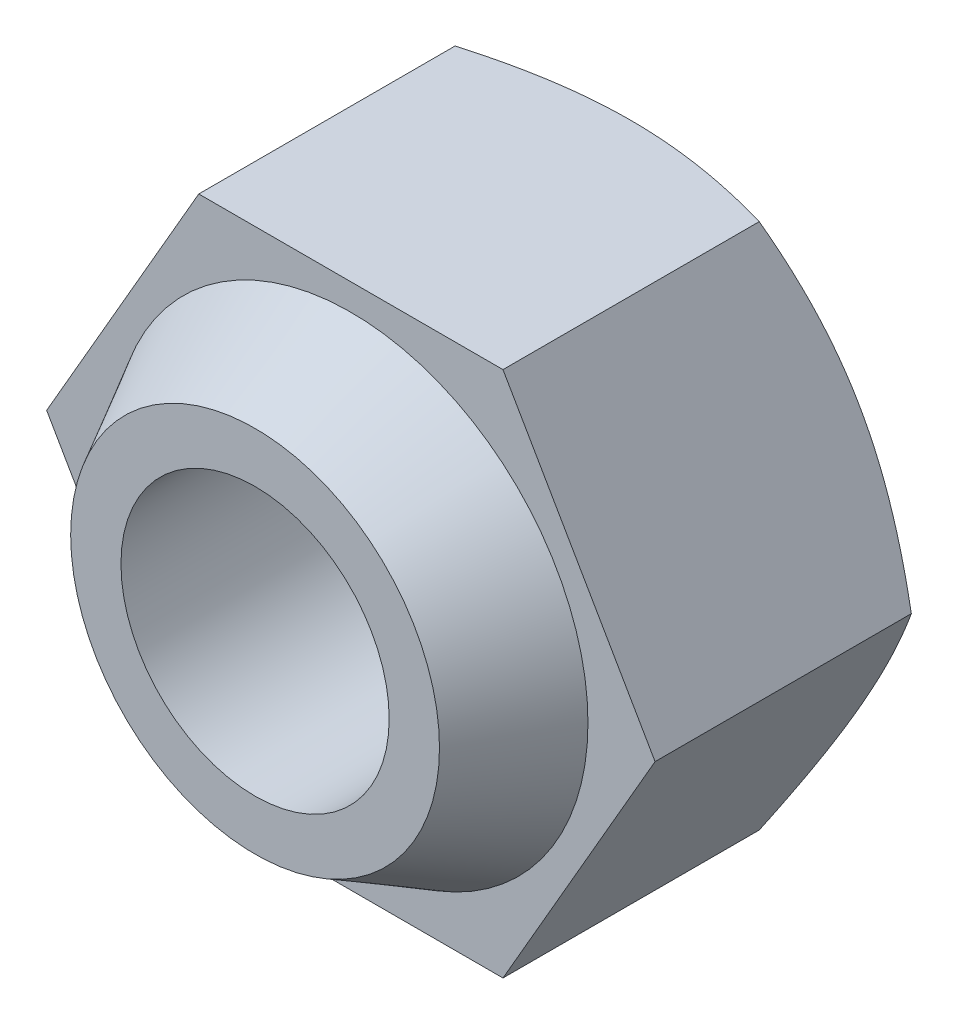
ISO-10303-21;
HEADER;
FILE_DESCRIPTION(('STEP AP214'),'2;1');
FILE_NAME('part.step','',(''),(''),'','','');
FILE_SCHEMA(('AUTOMOTIVE_DESIGN { 1 0 10303 214 1 1 1 1 }'));
ENDSEC;
DATA;
#1=APPLICATION_CONTEXT('core data for automotive mechanical design processes');
#2=APPLICATION_PROTOCOL_DEFINITION('international standard','automotive_design',2000,#1);
#3=PRODUCT_CONTEXT('',#1,'mechanical');
#4=PRODUCT('Part','Part','',(#3));
#5=PRODUCT_RELATED_PRODUCT_CATEGORY('part','',(#4));
#6=PRODUCT_DEFINITION_FORMATION('','',#4);
#7=PRODUCT_DEFINITION_CONTEXT('part definition',#1,'design');
#8=PRODUCT_DEFINITION('design','',#6,#7);
#9=PRODUCT_DEFINITION_SHAPE('','',#8);
#10=(LENGTH_UNIT() NAMED_UNIT(*) SI_UNIT(.MILLI.,.METRE.));
#11=(NAMED_UNIT(*) PLANE_ANGLE_UNIT() SI_UNIT($,.RADIAN.));
#12=(NAMED_UNIT(*) SI_UNIT($,.STERADIAN.) SOLID_ANGLE_UNIT());
#13=UNCERTAINTY_MEASURE_WITH_UNIT(LENGTH_MEASURE(1.E-05),#10,'distance_accuracy_value','');
#14=(GEOMETRIC_REPRESENTATION_CONTEXT(3) GLOBAL_UNCERTAINTY_ASSIGNED_CONTEXT((#13)) GLOBAL_UNIT_ASSIGNED_CONTEXT((#10,
#11,#12)) REPRESENTATION_CONTEXT('',''));
#15=CARTESIAN_POINT('',(0.,0.,0.));
#16=DIRECTION('',(0.,0.,1.));
#17=DIRECTION('',(1.,0.,0.));
#18=AXIS2_PLACEMENT_3D('',#15,#16,#17);
#19=CARTESIAN_POINT('',(0.,0.,4.));
#20=DIRECTION('',(0.,0.,1.));
#21=DIRECTION('',(1.,0.,0.));
#22=AXIS2_PLACEMENT_3D('',#19,#20,#21);
#23=PLANE('',#22);
#24=CARTESIAN_POINT('',(0.,0.,4.));
#25=DIRECTION('',(0.,0.,1.));
#26=DIRECTION('',(1.,0.,0.));
#27=AXIS2_PLACEMENT_3D('',#24,#25,#26);
#28=CIRCLE('',#27,1.4);
#29=CARTESIAN_POINT('',(1.4,0.,4.));
#30=VERTEX_POINT('',#29);
#31=EDGE_CURVE('E9',#30,#30,#28,.T.);
#32=ORIENTED_EDGE('',*,*,#31,.F.);
#33=EDGE_LOOP('',(#32));
#34=FACE_BOUND('',#33,.T.);
#35=CARTESIAN_POINT('',(0.,0.,4.));
#36=DIRECTION('',(0.,0.,1.));
#37=DIRECTION('',(1.,0.,0.));
#38=AXIS2_PLACEMENT_3D('',#35,#36,#37);
#39=CIRCLE('',#38,1.925);
#40=CARTESIAN_POINT('',(1.925,0.,4.));
#41=VERTEX_POINT('',#40);
#42=EDGE_CURVE('E136',#41,#41,#39,.T.);
#43=ORIENTED_EDGE('',*,*,#42,.T.);
#44=EDGE_LOOP('',(#43));
#45=FACE_BOUND('',#44,.T.);
#46=ADVANCED_FACE('F14',(#34,#45),#23,.T.);
#47=CARTESIAN_POINT('',(0.,0.,-5.));
#48=DIRECTION('',(0.,0.,1.));
#49=DIRECTION('',(1.,0.,0.));
#50=AXIS2_PLACEMENT_3D('',#47,#48,#49);
#51=CYLINDRICAL_SURFACE('',#50,1.4);
#52=DIRECTION('',(0.,0.,1.));
#53=VECTOR('',#52,1.);
#54=CARTESIAN_POINT('',(1.4,0.,-5.));
#55=LINE('',#54,#53);
#56=CARTESIAN_POINT('',(1.4,0.,0.));
#57=VERTEX_POINT('',#56);
#58=EDGE_CURVE('E25',#57,#30,#55,.T.);
#59=ORIENTED_EDGE('',*,*,#58,.F.);
#60=CARTESIAN_POINT('',(0.,0.,0.));
#61=DIRECTION('',(0.,0.,1.));
#62=DIRECTION('',(1.,0.,0.));
#63=AXIS2_PLACEMENT_3D('',#60,#61,#62);
#64=CIRCLE('',#63,1.4);
#65=EDGE_CURVE('E144',#57,#57,#64,.T.);
#66=ORIENTED_EDGE('',*,*,#65,.F.);
#67=ORIENTED_EDGE('',*,*,#58,.T.);
#68=ORIENTED_EDGE('',*,*,#31,.T.);
#69=EDGE_LOOP('',(#59,#66,#67,#68));
#70=FACE_BOUND('',#69,.T.);
#71=ADVANCED_FACE('F223',(#70),#51,.F.);
#72=CARTESIAN_POINT('',(0.,0.,3.));
#73=DIRECTION('',(0.,0.,-1.));
#74=DIRECTION('',(1.,0.,0.));
#75=AXIS2_PLACEMENT_3D('',#72,#73,#74);
#76=CONICAL_SURFACE('',#75,2.475,0.502843210928);
#77=ORIENTED_EDGE('',*,*,#42,.F.);
#78=DIRECTION('',(-0.481918749771887,0.,0.876215908676795));
#79=VECTOR('',#78,1.);
#80=CARTESIAN_POINT('',(2.475,0.,3.));
#81=LINE('',#80,#79);
#82=CARTESIAN_POINT('',(2.475,0.,3.));
#83=VERTEX_POINT('',#82);
#84=EDGE_CURVE('E143',#83,#41,#81,.T.);
#85=ORIENTED_EDGE('',*,*,#84,.F.);
#86=CARTESIAN_POINT('',(0.,0.,3.));
#87=DIRECTION('',(0.,0.,1.));
#88=DIRECTION('',(1.,0.,0.));
#89=AXIS2_PLACEMENT_3D('',#86,#87,#88);
#90=CIRCLE('',#89,2.475);
#91=EDGE_CURVE('E18',#83,#83,#90,.T.);
#92=ORIENTED_EDGE('',*,*,#91,.T.);
#93=ORIENTED_EDGE('',*,*,#84,.T.);
#94=EDGE_LOOP('',(#77,#85,#92,#93));
#95=FACE_BOUND('',#94,.T.);
#96=ADVANCED_FACE('F228',(#95),#76,.T.);
#97=CARTESIAN_POINT('',(0.,0.,0.));
#98=DIRECTION('',(0.,0.,1.));
#99=DIRECTION('',(1.,0.,0.));
#100=AXIS2_PLACEMENT_3D('',#97,#98,#99);
#101=PLANE('',#100);
#102=ORIENTED_EDGE('',*,*,#65,.T.);
#103=EDGE_LOOP('',(#102));
#104=FACE_BOUND('',#103,.T.);
#105=CARTESIAN_POINT('',(0.,0.,0.));
#106=DIRECTION('',(0.,0.,1.));
#107=DIRECTION('',(1.,0.,0.));
#108=AXIS2_PLACEMENT_3D('',#105,#106,#107);
#109=CIRCLE('',#108,2.6125);
#110=CARTESIAN_POINT('',(2.6125,0.,0.));
#111=VERTEX_POINT('',#110);
#112=EDGE_CURVE('E169',#111,#111,#109,.T.);
#113=ORIENTED_EDGE('',*,*,#112,.F.);
#114=EDGE_LOOP('',(#113));
#115=FACE_BOUND('',#114,.T.);
#116=ADVANCED_FACE('F16',(#104,#115),#101,.F.);
#117=CARTESIAN_POINT('',(-1.587713240271,-2.75,0.));
#118=DIRECTION('',(0.,1.,0.));
#119=DIRECTION('',(1.,0.,0.));
#120=AXIS2_PLACEMENT_3D('',#117,#118,#119);
#121=PLANE('',#120);
#122=DIRECTION('',(0.,0.,1.));
#123=VECTOR('',#122,1.);
#124=CARTESIAN_POINT('',(1.587713240271,-2.75,0.));
#125=LINE('',#124,#123);
#126=CARTESIAN_POINT('',(1.587713240271,-2.75,0.325005755075));
#127=VERTEX_POINT('',#126);
#128=CARTESIAN_POINT('',(1.587713240271,-2.75,3.));
#129=VERTEX_POINT('',#128);
#130=EDGE_CURVE('E106',#127,#129,#125,.T.);
#131=ORIENTED_EDGE('',*,*,#130,.T.);
#132=DIRECTION('',(1.,0.,0.));
#133=VECTOR('',#132,1.);
#134=CARTESIAN_POINT('',(-1.587713240271,-2.75,3.));
#135=LINE('',#134,#133);
#136=CARTESIAN_POINT('',(-1.587713240271,-2.75,3.));
#137=VERTEX_POINT('',#136);
#138=EDGE_CURVE('E153',#137,#129,#135,.T.);
#139=ORIENTED_EDGE('',*,*,#138,.F.);
#140=DIRECTION('',(0.,0.,1.));
#141=VECTOR('',#140,1.);
#142=CARTESIAN_POINT('',(-1.587713240271,-2.75,0.));
#143=LINE('',#142,#141);
#144=CARTESIAN_POINT('',(-1.587713240271,-2.75,0.325005755075));
#145=VERTEX_POINT('',#144);
#146=EDGE_CURVE('E105',#145,#137,#143,.T.);
#147=ORIENTED_EDGE('',*,*,#146,.F.);
#148=CARTESIAN_POINT('',(-1.5877132402698,-2.75,0.325005755074307));
#149=CARTESIAN_POINT('',(5.99964522507435E-13,-2.75,-0.133327578258219));
#150=CARTESIAN_POINT('',(1.5877132402714,-2.75,0.325005755074769));
#151=(BOUNDED_CURVE() B_SPLINE_CURVE(2,(#148,#149,#150),.UNSPECIFIED.,.F.,
.F.) B_SPLINE_CURVE_WITH_KNOTS((3,3),(0.,1.),
.UNSPECIFIED.) CURVE() GEOMETRIC_REPRESENTATION_ITEM() RATIONAL_B_SPLINE_CURVE((1.,
1.15470053837909,1.)) REPRESENTATION_ITEM(''));
#152=EDGE_CURVE('E122',#145,#127,#151,.T.);
#153=ORIENTED_EDGE('',*,*,#152,.T.);
#154=EDGE_LOOP('',(#131,#139,#147,#153));
#155=FACE_BOUND('',#154,.T.);
#156=ADVANCED_FACE('F194',(#155),#121,.F.);
#157=CARTESIAN_POINT('',(-3.175426480543,0.,0.));
#158=DIRECTION('',(0.866025403784329,0.50000000000019,0.));
#159=DIRECTION('',(0.,0.,-1.));
#160=AXIS2_PLACEMENT_3D('',#157,#158,#159);
#161=PLANE('',#160);
#162=ORIENTED_EDGE('',*,*,#146,.T.);
#163=DIRECTION('',(0.50000000000019,-0.866025403784329,0.));
#164=VECTOR('',#163,1.);
#165=CARTESIAN_POINT('',(-3.175426480543,0.,3.));
#166=LINE('',#165,#164);
#167=CARTESIAN_POINT('',(-3.175426480543,0.,3.));
#168=VERTEX_POINT('',#167);
#169=EDGE_CURVE('E101',#168,#137,#166,.T.);
#170=ORIENTED_EDGE('',*,*,#169,.F.);
#171=DIRECTION('',(0.,0.,1.));
#172=VECTOR('',#171,1.);
#173=CARTESIAN_POINT('',(-3.175426480543,0.,0.));
#174=LINE('',#173,#172);
#175=CARTESIAN_POINT('',(-3.175426480543,0.,0.325005755075));
#176=VERTEX_POINT('',#175);
#177=EDGE_CURVE('E94',#176,#168,#174,.T.);
#178=ORIENTED_EDGE('',*,*,#177,.F.);
#179=CARTESIAN_POINT('',(-3.17542648054311,0.,0.325005755075004));
#180=CARTESIAN_POINT('',(-2.381569860407,-1.375,-0.133327578258568));
#181=CARTESIAN_POINT('',(-1.5877132402709,-2.74999999999994,0.325005755075001));
#182=(BOUNDED_CURVE() B_SPLINE_CURVE(2,(#179,#180,#181),.UNSPECIFIED.,.F.,
.F.) B_SPLINE_CURVE_WITH_KNOTS((3,3),(0.,1.),
.UNSPECIFIED.) CURVE() GEOMETRIC_REPRESENTATION_ITEM() RATIONAL_B_SPLINE_CURVE((1.,
1.15470053837938,1.)) REPRESENTATION_ITEM(''));
#183=EDGE_CURVE('E98',#176,#145,#182,.T.);
#184=ORIENTED_EDGE('',*,*,#183,.T.);
#185=EDGE_LOOP('',(#162,#170,#178,#184));
#186=FACE_BOUND('',#185,.T.);
#187=ADVANCED_FACE('F96',(#186),#161,.F.);
#188=CARTESIAN_POINT('',(-1.587713240271,2.75,0.));
#189=DIRECTION('',(0.866025403784329,-0.50000000000019,0.));
#190=DIRECTION('',(0.,0.,-1.));
#191=AXIS2_PLACEMENT_3D('',#188,#189,#190);
#192=PLANE('',#191);
#193=ORIENTED_EDGE('',*,*,#177,.T.);
#194=DIRECTION('',(-0.50000000000019,-0.866025403784329,0.));
#195=VECTOR('',#194,1.);
#196=CARTESIAN_POINT('',(-1.587713240271,2.75,3.));
#197=LINE('',#196,#195);
#198=CARTESIAN_POINT('',(-1.587713240271,2.75,3.));
#199=VERTEX_POINT('',#198);
#200=EDGE_CURVE('E154',#199,#168,#197,.T.);
#201=ORIENTED_EDGE('',*,*,#200,.F.);
#202=DIRECTION('',(0.,0.,1.));
#203=VECTOR('',#202,1.);
#204=CARTESIAN_POINT('',(-1.587713240271,2.75,0.));
#205=LINE('',#204,#203);
#206=CARTESIAN_POINT('',(-1.587713240271,2.75,0.325005755075));
#207=VERTEX_POINT('',#206);
#208=EDGE_CURVE('E112',#207,#199,#205,.T.);
#209=ORIENTED_EDGE('',*,*,#208,.F.);
#210=CARTESIAN_POINT('',(-1.5877132402709,2.74999999999994,0.325005755075004));
#211=CARTESIAN_POINT('',(-2.381569860407,1.375,-0.133327578258567));
#212=CARTESIAN_POINT('',(-3.17542648054311,0.,0.325005755075001));
#213=(BOUNDED_CURVE() B_SPLINE_CURVE(2,(#210,#211,#212),.UNSPECIFIED.,.F.,
.F.) B_SPLINE_CURVE_WITH_KNOTS((3,3),(0.,1.),
.UNSPECIFIED.) CURVE() GEOMETRIC_REPRESENTATION_ITEM() RATIONAL_B_SPLINE_CURVE((1.,
1.15470053837939,1.)) REPRESENTATION_ITEM(''));
#214=EDGE_CURVE('E109',#207,#176,#213,.T.);
#215=ORIENTED_EDGE('',*,*,#214,.T.);
#216=EDGE_LOOP('',(#193,#201,#209,#215));
#217=FACE_BOUND('',#216,.T.);
#218=ADVANCED_FACE('F110',(#217),#192,.F.);
#219=CARTESIAN_POINT('',(1.587713240271,-2.75,0.));
#220=DIRECTION('',(-0.866025403784329,0.50000000000019,0.));
#221=DIRECTION('',(0.,0.,1.));
#222=AXIS2_PLACEMENT_3D('',#219,#220,#221);
#223=PLANE('',#222);
#224=DIRECTION('',(0.,0.,1.));
#225=VECTOR('',#224,1.);
#226=CARTESIAN_POINT('',(3.175426480543,0.,0.));
#227=LINE('',#226,#225);
#228=CARTESIAN_POINT('',(3.175426480543,0.,0.325005755075));
#229=VERTEX_POINT('',#228);
#230=CARTESIAN_POINT('',(3.175426480543,0.,3.));
#231=VERTEX_POINT('',#230);
#232=EDGE_CURVE('E149',#229,#231,#227,.T.);
#233=ORIENTED_EDGE('',*,*,#232,.T.);
#234=DIRECTION('',(0.50000000000019,0.866025403784329,0.));
#235=VECTOR('',#234,1.);
#236=CARTESIAN_POINT('',(1.587713240271,-2.75,3.));
#237=LINE('',#236,#235);
#238=EDGE_CURVE('E186',#129,#231,#237,.T.);
#239=ORIENTED_EDGE('',*,*,#238,.F.);
#240=ORIENTED_EDGE('',*,*,#130,.F.);
#241=CARTESIAN_POINT('',(1.5877132402709,-2.74999999999994,0.325005755075004));
#242=CARTESIAN_POINT('',(2.381569860407,-1.375,-0.133327578258567));
#243=CARTESIAN_POINT('',(3.17542648054311,0.,0.325005755075001));
#244=(BOUNDED_CURVE() B_SPLINE_CURVE(2,(#241,#242,#243),.UNSPECIFIED.,.F.,
.F.) B_SPLINE_CURVE_WITH_KNOTS((3,3),(0.,1.),
.UNSPECIFIED.) CURVE() GEOMETRIC_REPRESENTATION_ITEM() RATIONAL_B_SPLINE_CURVE((1.,
1.15470053837939,1.)) REPRESENTATION_ITEM(''));
#245=EDGE_CURVE('E129',#127,#229,#244,.T.);
#246=ORIENTED_EDGE('',*,*,#245,.T.);
#247=EDGE_LOOP('',(#233,#239,#240,#246));
#248=FACE_BOUND('',#247,.T.);
#249=ADVANCED_FACE('F235',(#248),#223,.F.);
#250=CARTESIAN_POINT('',(0.,0.,3.));
#251=DIRECTION('',(0.,0.,1.));
#252=DIRECTION('',(1.,0.,0.));
#253=AXIS2_PLACEMENT_3D('',#250,#251,#252);
#254=PLANE('',#253);
#255=ORIENTED_EDGE('',*,*,#91,.F.);
#256=EDGE_LOOP('',(#255));
#257=FACE_BOUND('',#256,.T.);
#258=DIRECTION('',(-0.50000000000019,0.866025403784329,0.));
#259=VECTOR('',#258,1.);
#260=CARTESIAN_POINT('',(3.175426480543,0.,3.));
#261=LINE('',#260,#259);
#262=CARTESIAN_POINT('',(1.587713240271,2.75,3.));
#263=VERTEX_POINT('',#262);
#264=EDGE_CURVE('E145',#231,#263,#261,.T.);
#265=ORIENTED_EDGE('',*,*,#264,.T.);
#266=DIRECTION('',(-1.,0.,0.));
#267=VECTOR('',#266,1.);
#268=CARTESIAN_POINT('',(1.587713240271,2.75,3.));
#269=LINE('',#268,#267);
#270=EDGE_CURVE('E201',#263,#199,#269,.T.);
#271=ORIENTED_EDGE('',*,*,#270,.T.);
#272=ORIENTED_EDGE('',*,*,#200,.T.);
#273=ORIENTED_EDGE('',*,*,#169,.T.);
#274=ORIENTED_EDGE('',*,*,#138,.T.);
#275=ORIENTED_EDGE('',*,*,#238,.T.);
#276=EDGE_LOOP('',(#265,#271,#272,#273,#274,#275));
#277=FACE_BOUND('',#276,.T.);
#278=ADVANCED_FACE('F199',(#257,#277),#254,.T.);
#279=CARTESIAN_POINT('',(1.587713240271,2.75,0.));
#280=DIRECTION('',(0.,-1.,0.));
#281=DIRECTION('',(-1.,0.,0.));
#282=AXIS2_PLACEMENT_3D('',#279,#280,#281);
#283=PLANE('',#282);
#284=ORIENTED_EDGE('',*,*,#208,.T.);
#285=ORIENTED_EDGE('',*,*,#270,.F.);
#286=DIRECTION('',(0.,0.,1.));
#287=VECTOR('',#286,1.);
#288=CARTESIAN_POINT('',(1.587713240271,2.75,0.));
#289=LINE('',#288,#287);
#290=CARTESIAN_POINT('',(1.587713240271,2.75,0.325005755075));
#291=VERTEX_POINT('',#290);
#292=EDGE_CURVE('E150',#291,#263,#289,.T.);
#293=ORIENTED_EDGE('',*,*,#292,.F.);
#294=CARTESIAN_POINT('',(1.5877132402698,2.75,0.325005755074307));
#295=CARTESIAN_POINT('',(-5.99964522507435E-13,2.75,-0.133327578258219));
#296=CARTESIAN_POINT('',(-1.5877132402714,2.75,0.325005755074769));
#297=(BOUNDED_CURVE() B_SPLINE_CURVE(2,(#294,#295,#296),.UNSPECIFIED.,.F.,
.F.) B_SPLINE_CURVE_WITH_KNOTS((3,3),(0.,1.),
.UNSPECIFIED.) CURVE() GEOMETRIC_REPRESENTATION_ITEM() RATIONAL_B_SPLINE_CURVE((1.,
1.15470053837909,1.)) REPRESENTATION_ITEM(''));
#298=EDGE_CURVE('E116',#291,#207,#297,.T.);
#299=ORIENTED_EDGE('',*,*,#298,.T.);
#300=EDGE_LOOP('',(#284,#285,#293,#299));
#301=FACE_BOUND('',#300,.T.);
#302=ADVANCED_FACE('F256',(#301),#283,.F.);
#303=CARTESIAN_POINT('',(0.,0.,0.));
#304=DIRECTION('',(0.,0.,1.));
#305=DIRECTION('',(1.,0.,0.));
#306=AXIS2_PLACEMENT_3D('',#303,#304,#305);
#307=CONICAL_SURFACE('',#306,2.6125,1.047197551197);
#308=DIRECTION('',(0.866025403784329,0.,0.50000000000019));
#309=VECTOR('',#308,1.);
#310=CARTESIAN_POINT('',(2.6125,0.,0.));
#311=LINE('',#310,#309);
#312=EDGE_CURVE('E161',#111,#229,#311,.T.);
#313=ORIENTED_EDGE('',*,*,#312,.F.);
#314=ORIENTED_EDGE('',*,*,#112,.T.);
#315=ORIENTED_EDGE('',*,*,#312,.T.);
#316=ORIENTED_EDGE('',*,*,#245,.F.);
#317=ORIENTED_EDGE('',*,*,#152,.F.);
#318=ORIENTED_EDGE('',*,*,#183,.F.);
#319=ORIENTED_EDGE('',*,*,#214,.F.);
#320=ORIENTED_EDGE('',*,*,#298,.F.);
#321=CARTESIAN_POINT('',(3.17542648054311,0.,0.325005755075003));
#322=CARTESIAN_POINT('',(2.381569860407,1.375,-0.133327578258568));
#323=CARTESIAN_POINT('',(1.5877132402709,2.74999999999994,0.325005755075001));
#324=(BOUNDED_CURVE() B_SPLINE_CURVE(2,(#321,#322,#323),.UNSPECIFIED.,.F.,
.F.) B_SPLINE_CURVE_WITH_KNOTS((3,3),(0.,1.),
.UNSPECIFIED.) CURVE() GEOMETRIC_REPRESENTATION_ITEM() RATIONAL_B_SPLINE_CURVE((1.,
1.15470053837938,1.)) REPRESENTATION_ITEM(''));
#325=EDGE_CURVE('E155',#229,#291,#324,.T.);
#326=ORIENTED_EDGE('',*,*,#325,.F.);
#327=EDGE_LOOP('',(#313,#314,#315,#316,#317,#318,#319,#320,#326));
#328=FACE_BOUND('',#327,.T.);
#329=ADVANCED_FACE('F119',(#328),#307,.T.);
#330=CARTESIAN_POINT('',(3.175426480543,0.,0.));
#331=DIRECTION('',(-0.866025403784329,-0.50000000000019,0.));
#332=DIRECTION('',(-0.50000000000019,0.866025403784329,0.));
#333=AXIS2_PLACEMENT_3D('',#330,#331,#332);
#334=PLANE('',#333);
#335=ORIENTED_EDGE('',*,*,#292,.T.);
#336=ORIENTED_EDGE('',*,*,#264,.F.);
#337=ORIENTED_EDGE('',*,*,#232,.F.);
#338=ORIENTED_EDGE('',*,*,#325,.T.);
#339=EDGE_LOOP('',(#335,#336,#337,#338));
#340=FACE_BOUND('',#339,.T.);
#341=ADVANCED_FACE('F254',(#340),#334,.F.);
#342=CLOSED_SHELL('',(#46,#71,#96,#116,#156,#187,#218,#249,#278,#302,#329,#341));
#343=MANIFOLD_SOLID_BREP('B1',#342);
#344=ADVANCED_BREP_SHAPE_REPRESENTATION('',(#18,#343),#14);
#345=SHAPE_DEFINITION_REPRESENTATION(#9,#344);
ENDSEC;
END-ISO-10303-21;
